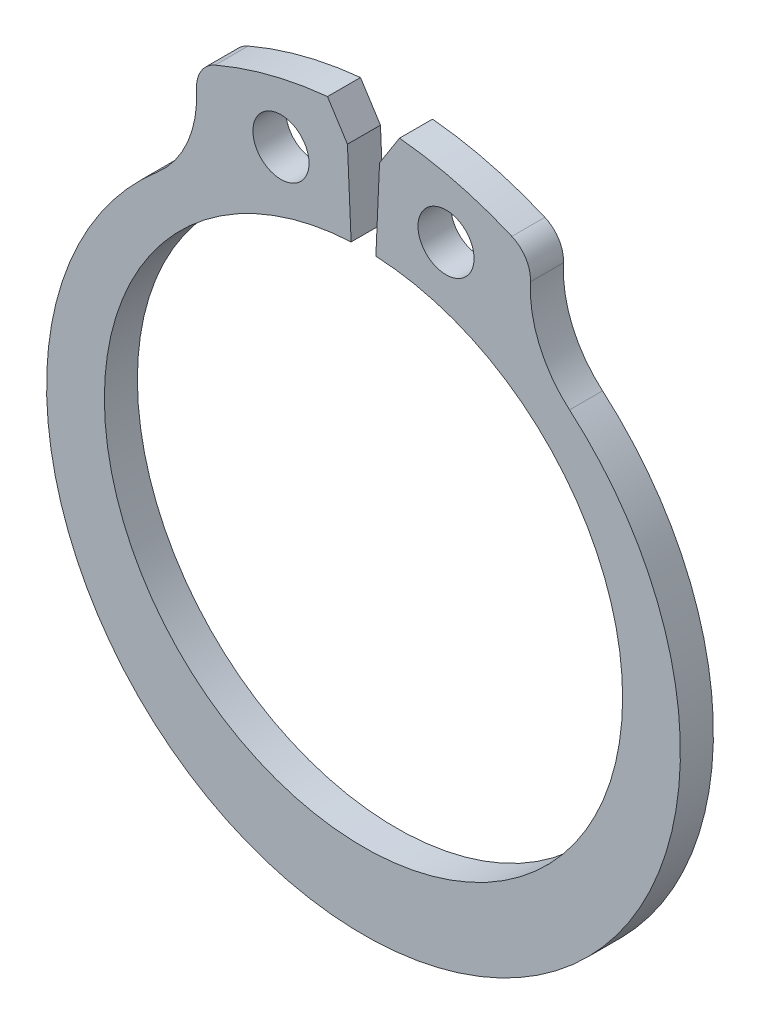
ISO-10303-21;
HEADER;
FILE_DESCRIPTION(('STEP AP214'),'2;1');
FILE_NAME('part.step','',(''),(''),'','','');
FILE_SCHEMA(('AUTOMOTIVE_DESIGN { 1 0 10303 214 1 1 1 1 }'));
ENDSEC;
DATA;
#1=APPLICATION_CONTEXT('core data for automotive mechanical design processes');
#2=APPLICATION_PROTOCOL_DEFINITION('international standard','automotive_design',2000,#1);
#3=PRODUCT_CONTEXT('',#1,'mechanical');
#4=PRODUCT('Part','Part','',(#3));
#5=PRODUCT_RELATED_PRODUCT_CATEGORY('part','',(#4));
#6=PRODUCT_DEFINITION_FORMATION('','',#4);
#7=PRODUCT_DEFINITION_CONTEXT('part definition',#1,'design');
#8=PRODUCT_DEFINITION('design','',#6,#7);
#9=PRODUCT_DEFINITION_SHAPE('','',#8);
#10=(LENGTH_UNIT() NAMED_UNIT(*) SI_UNIT(.MILLI.,.METRE.));
#11=(NAMED_UNIT(*) PLANE_ANGLE_UNIT() SI_UNIT($,.RADIAN.));
#12=(NAMED_UNIT(*) SI_UNIT($,.STERADIAN.) SOLID_ANGLE_UNIT());
#13=UNCERTAINTY_MEASURE_WITH_UNIT(LENGTH_MEASURE(1.E-05),#10,'distance_accuracy_value','');
#14=(GEOMETRIC_REPRESENTATION_CONTEXT(3) GLOBAL_UNCERTAINTY_ASSIGNED_CONTEXT((#13)) GLOBAL_UNIT_ASSIGNED_CONTEXT((#10,
#11,#12)) REPRESENTATION_CONTEXT('',''));
#15=CARTESIAN_POINT('',(0.,0.,0.));
#16=DIRECTION('',(0.,0.,1.));
#17=DIRECTION('',(1.,0.,0.));
#18=AXIS2_PLACEMENT_3D('',#15,#16,#17);
#19=CARTESIAN_POINT('',(0.,0.00859437985994194,0.5));
#20=DIRECTION('',(0.,0.,-1.));
#21=DIRECTION('',(1.,0.,0.));
#22=AXIS2_PLACEMENT_3D('',#19,#20,#21);
#23=CYLINDRICAL_SURFACE('',#22,1.9625);
#24=DIRECTION('',(0.,0.,1.));
#25=VECTOR('',#24,1.);
#26=CARTESIAN_POINT('',(0.0936240497671285,1.96885986884484,0.5));
#27=LINE('',#26,#25);
#28=CARTESIAN_POINT('',(0.0936240497671285,1.96885986884484,0.375));
#29=VERTEX_POINT('',#28);
#30=CARTESIAN_POINT('',(0.0936240497671285,1.96885986884484,0.625));
#31=VERTEX_POINT('',#30);
#32=EDGE_CURVE('E53',#29,#31,#27,.T.);
#33=ORIENTED_EDGE('',*,*,#32,.F.);
#34=CARTESIAN_POINT('',(0.,0.00859437985994194,0.375));
#35=DIRECTION('',(0.,0.,1.));
#36=DIRECTION('',(1.,0.,0.));
#37=AXIS2_PLACEMENT_3D('',#34,#35,#36);
#38=CIRCLE('',#37,1.9625);
#39=CARTESIAN_POINT('',(-0.0936240497671285,1.96885986884484,0.375));
#40=VERTEX_POINT('',#39);
#41=EDGE_CURVE('E143',#40,#29,#38,.T.);
#42=ORIENTED_EDGE('',*,*,#41,.F.);
#43=DIRECTION('',(0.,0.,-1.));
#44=VECTOR('',#43,1.);
#45=CARTESIAN_POINT('',(-0.0936240497671285,1.96885986884484,0.5));
#46=LINE('',#45,#44);
#47=CARTESIAN_POINT('',(-0.0936240497671285,1.96885986884484,0.625));
#48=VERTEX_POINT('',#47);
#49=EDGE_CURVE('E11',#48,#40,#46,.T.);
#50=ORIENTED_EDGE('',*,*,#49,.F.);
#51=CARTESIAN_POINT('',(0.,0.00859437985994194,0.625));
#52=DIRECTION('',(0.,0.,-1.));
#53=DIRECTION('',(1.,0.,0.));
#54=AXIS2_PLACEMENT_3D('',#51,#52,#53);
#55=CIRCLE('',#54,1.9625);
#56=EDGE_CURVE('E147',#31,#48,#55,.T.);
#57=ORIENTED_EDGE('',*,*,#56,.F.);
#58=EDGE_LOOP('',(#33,#42,#50,#57));
#59=FACE_BOUND('',#58,.T.);
#60=ADVANCED_FACE('F34',(#59),#23,.F.);
#61=CARTESIAN_POINT('',(-0.063877216940033,1.30234437985994,0.625));
#62=DIRECTION('',(0.999005550404976,0.0445859872611464,0.));
#63=DIRECTION('',(0.0445859872611464,-0.999005550404976,0.));
#64=AXIS2_PLACEMENT_3D('',#61,#62,#63);
#65=PLANE('',#64);
#66=ORIENTED_EDGE('',*,*,#49,.T.);
#67=DIRECTION('',(-0.0445859872611464,0.999005550404976,0.));
#68=VECTOR('',#67,1.);
#69=CARTESIAN_POINT('',(0.,-0.128905620140058,0.375));
#70=LINE('',#69,#68);
#71=CARTESIAN_POINT('',(-0.121617758016831,2.59609437985994,0.375));
#72=VERTEX_POINT('',#71);
#73=EDGE_CURVE('E44',#40,#72,#70,.T.);
#74=ORIENTED_EDGE('',*,*,#73,.T.);
#75=DIRECTION('',(0.,0.,-1.));
#76=VECTOR('',#75,1.);
#77=CARTESIAN_POINT('',(-0.121617758016832,2.59609437985994,0.625));
#78=LINE('',#77,#76);
#79=CARTESIAN_POINT('',(-0.121617758016832,2.59609437985994,0.625));
#80=VERTEX_POINT('',#79);
#81=EDGE_CURVE('E138',#80,#72,#78,.T.);
#82=ORIENTED_EDGE('',*,*,#81,.F.);
#83=DIRECTION('',(-0.0445859872611464,0.999005550404976,0.));
#84=VECTOR('',#83,1.);
#85=CARTESIAN_POINT('',(0.,-0.128905620140058,0.625));
#86=LINE('',#85,#84);
#87=EDGE_CURVE('E145',#48,#80,#86,.T.);
#88=ORIENTED_EDGE('',*,*,#87,.F.);
#89=EDGE_LOOP('',(#66,#74,#82,#88));
#90=FACE_BOUND('',#89,.T.);
#91=ADVANCED_FACE('F36',(#90),#65,.T.);
#92=CARTESIAN_POINT('',(0.896844712426765,0.102705488445193,0.375));
#93=DIRECTION('',(0.,0.,1.));
#94=DIRECTION('',(1.,0.,0.));
#95=AXIS2_PLACEMENT_3D('',#92,#93,#94);
#96=PLANE('',#95);
#97=ORIENTED_EDGE('',*,*,#41,.T.);
#98=DIRECTION('',(0.0445859872611464,0.999005550404976,0.));
#99=VECTOR('',#98,1.);
#100=CARTESIAN_POINT('',(0.,-0.128905620140058,0.375));
#101=LINE('',#100,#99);
#102=CARTESIAN_POINT('',(0.121617758016831,2.59609437985994,0.375));
#103=VERTEX_POINT('',#102);
#104=EDGE_CURVE('E159',#29,#103,#101,.T.);
#105=ORIENTED_EDGE('',*,*,#104,.T.);
#106=DIRECTION('',(0.53811537282345,0.842871191541792,0.));
#107=VECTOR('',#106,1.);
#108=CARTESIAN_POINT('',(0.121617758016831,2.59609437985994,0.375));
#109=LINE('',#108,#107);
#110=CARTESIAN_POINT('',(0.272832027434316,2.83294721454722,0.375));
#111=VERTEX_POINT('',#110);
#112=EDGE_CURVE('E151',#103,#111,#109,.T.);
#113=ORIENTED_EDGE('',*,*,#112,.T.);
#114=CARTESIAN_POINT('',(0.,0.00859437985994194,0.375));
#115=DIRECTION('',(0.,0.,1.));
#116=DIRECTION('',(1.,0.,0.));
#117=AXIS2_PLACEMENT_3D('',#114,#115,#116);
#118=CIRCLE('',#117,2.8375);
#119=CARTESIAN_POINT('',(1.12351685285583,2.61418761967097,0.375));
#120=VERTEX_POINT('',#119);
#121=EDGE_CURVE('E164',#120,#111,#118,.T.);
#122=ORIENTED_EDGE('',*,*,#121,.F.);
#123=CARTESIAN_POINT('',(1.03096282136506,2.39954183295526,0.375));
#124=DIRECTION('',(0.,0.,1.));
#125=DIRECTION('',(1.,0.,0.));
#126=AXIS2_PLACEMENT_3D('',#123,#124,#125);
#127=CIRCLE('',#126,0.23375);
#128=CARTESIAN_POINT('',(1.26436415394966,2.3867793705074,0.375));
#129=VERTEX_POINT('',#128);
#130=EDGE_CURVE('E200',#129,#120,#127,.T.);
#131=ORIENTED_EDGE('',*,*,#130,.F.);
#132=CARTESIAN_POINT('',(2.11309627243911,2.34037041615153,0.375));
#133=DIRECTION('',(0.,0.,1.));
#134=DIRECTION('',(1.,0.,0.));
#135=AXIS2_PLACEMENT_3D('',#132,#133,#134);
#136=CIRCLE('',#135,0.85);
#137=CARTESIAN_POINT('',(1.56044032426273,1.69455976050604,0.375));
#138=VERTEX_POINT('',#137);
#139=EDGE_CURVE('E148',#129,#138,#136,.T.);
#140=ORIENTED_EDGE('',*,*,#139,.T.);
#141=CARTESIAN_POINT('',(0.,-0.128905620140058,0.375));
#142=DIRECTION('',(0.,0.,1.));
#143=DIRECTION('',(1.,0.,0.));
#144=AXIS2_PLACEMENT_3D('',#141,#142,#143);
#145=CIRCLE('',#144,2.4);
#146=CARTESIAN_POINT('',(-1.56044032426273,1.69455976050604,0.374999999999999));
#147=VERTEX_POINT('',#146);
#148=EDGE_CURVE('E177',#147,#138,#145,.T.);
#149=ORIENTED_EDGE('',*,*,#148,.F.);
#150=CARTESIAN_POINT('',(-2.11309627243911,2.34037041615153,0.374999999999999));
#151=DIRECTION('',(0.,0.,-1.));
#152=DIRECTION('',(-1.,0.,0.));
#153=AXIS2_PLACEMENT_3D('',#150,#151,#152);
#154=CIRCLE('',#153,0.85);
#155=CARTESIAN_POINT('',(-1.26436415394966,2.3867793705074,0.374999999999999));
#156=VERTEX_POINT('',#155);
#157=EDGE_CURVE('E109',#156,#147,#154,.T.);
#158=ORIENTED_EDGE('',*,*,#157,.F.);
#159=CARTESIAN_POINT('',(-1.03096282136506,2.39954183295526,0.374999999999999));
#160=DIRECTION('',(0.,0.,1.));
#161=DIRECTION('',(-1.,0.,0.));
#162=AXIS2_PLACEMENT_3D('',#159,#160,#161);
#163=CIRCLE('',#162,0.23375);
#164=CARTESIAN_POINT('',(-1.12351685285583,2.61418761967097,0.374999999999999));
#165=VERTEX_POINT('',#164);
#166=EDGE_CURVE('E127',#165,#156,#163,.T.);
#167=ORIENTED_EDGE('',*,*,#166,.F.);
#168=CARTESIAN_POINT('',(0.,0.00859437985994194,0.375));
#169=DIRECTION('',(0.,0.,1.));
#170=DIRECTION('',(-1.,0.,0.));
#171=AXIS2_PLACEMENT_3D('',#168,#169,#170);
#172=CIRCLE('',#171,2.8375);
#173=CARTESIAN_POINT('',(-0.272832027434317,2.83294721454722,0.375));
#174=VERTEX_POINT('',#173);
#175=EDGE_CURVE('E104',#174,#165,#172,.T.);
#176=ORIENTED_EDGE('',*,*,#175,.F.);
#177=DIRECTION('',(-0.53811537282345,0.842871191541792,0.));
#178=VECTOR('',#177,1.);
#179=CARTESIAN_POINT('',(-0.121617758016831,2.59609437985994,0.375));
#180=LINE('',#179,#178);
#181=EDGE_CURVE('E134',#72,#174,#180,.T.);
#182=ORIENTED_EDGE('',*,*,#181,.F.);
#183=ORIENTED_EDGE('',*,*,#73,.F.);
#184=EDGE_LOOP('',(#97,#105,#113,#122,#131,#140,#149,#158,#167,#176,#182,#183));
#185=FACE_BOUND('',#184,.T.);
#186=CARTESIAN_POINT('',(0.625,2.32578556748344,0.375));
#187=DIRECTION('',(0.,0.,1.));
#188=DIRECTION('',(1.,0.,0.));
#189=AXIS2_PLACEMENT_3D('',#186,#187,#188);
#190=CIRCLE('',#189,0.2125);
#191=CARTESIAN_POINT('',(0.4125,2.32578556748344,0.375));
#192=VERTEX_POINT('',#191);
#193=EDGE_CURVE('E141',#192,#192,#190,.T.);
#194=ORIENTED_EDGE('',*,*,#193,.T.);
#195=EDGE_LOOP('',(#194));
#196=FACE_BOUND('',#195,.T.);
#197=CARTESIAN_POINT('',(-0.625,2.32578556748344,0.375));
#198=DIRECTION('',(0.,0.,1.));
#199=DIRECTION('',(-1.,0.,0.));
#200=AXIS2_PLACEMENT_3D('',#197,#198,#199);
#201=CIRCLE('',#200,0.2125);
#202=CARTESIAN_POINT('',(-0.4125,2.32578556748344,0.375));
#203=VERTEX_POINT('',#202);
#204=EDGE_CURVE('E137',#203,#203,#201,.T.);
#205=ORIENTED_EDGE('',*,*,#204,.T.);
#206=EDGE_LOOP('',(#205));
#207=FACE_BOUND('',#206,.T.);
#208=ADVANCED_FACE('F246',(#185,#196,#207),#96,.F.);
#209=CARTESIAN_POINT('',(-0.625,2.32578556748344,0.5));
#210=DIRECTION('',(0.,0.,1.));
#211=DIRECTION('',(-1.,0.,0.));
#212=AXIS2_PLACEMENT_3D('',#209,#210,#211);
#213=CYLINDRICAL_SURFACE('',#212,0.2125);
#214=CARTESIAN_POINT('',(-0.625,2.32578556748344,0.625));
#215=DIRECTION('',(0.,0.,-1.));
#216=DIRECTION('',(-1.,0.,0.));
#217=AXIS2_PLACEMENT_3D('',#214,#215,#216);
#218=CIRCLE('',#217,0.2125);
#219=CARTESIAN_POINT('',(-0.4125,2.32578556748344,0.625));
#220=VERTEX_POINT('',#219);
#221=EDGE_CURVE('E132',#220,#220,#218,.T.);
#222=ORIENTED_EDGE('',*,*,#221,.F.);
#223=EDGE_LOOP('',(#222));
#224=FACE_BOUND('',#223,.T.);
#225=ORIENTED_EDGE('',*,*,#204,.F.);
#226=EDGE_LOOP('',(#225));
#227=FACE_BOUND('',#226,.T.);
#228=ADVANCED_FACE('F272',(#224,#227),#213,.F.);
#229=CARTESIAN_POINT('',(-0.197224892725574,2.71452079720358,0.625));
#230=DIRECTION('',(0.842871191541792,0.53811537282345,0.));
#231=DIRECTION('',(0.53811537282345,-0.842871191541792,0.));
#232=AXIS2_PLACEMENT_3D('',#229,#230,#231);
#233=PLANE('',#232);
#234=ORIENTED_EDGE('',*,*,#181,.T.);
#235=DIRECTION('',(0.,0.,-1.));
#236=VECTOR('',#235,1.);
#237=CARTESIAN_POINT('',(-0.272832027434317,2.83294721454722,0.625));
#238=LINE('',#237,#236);
#239=CARTESIAN_POINT('',(-0.272832027434317,2.83294721454722,0.625));
#240=VERTEX_POINT('',#239);
#241=EDGE_CURVE('E122',#240,#174,#238,.T.);
#242=ORIENTED_EDGE('',*,*,#241,.F.);
#243=DIRECTION('',(-0.53811537282345,0.842871191541792,0.));
#244=VECTOR('',#243,1.);
#245=CARTESIAN_POINT('',(-0.121617758016832,2.59609437985994,0.625));
#246=LINE('',#245,#244);
#247=EDGE_CURVE('E120',#80,#240,#246,.T.);
#248=ORIENTED_EDGE('',*,*,#247,.F.);
#249=ORIENTED_EDGE('',*,*,#81,.T.);
#250=EDGE_LOOP('',(#234,#242,#248,#249));
#251=FACE_BOUND('',#250,.T.);
#252=ADVANCED_FACE('F302',(#251),#233,.T.);
#253=CARTESIAN_POINT('',(0.,0.00859437985994194,0.625));
#254=DIRECTION('',(0.,0.,1.));
#255=DIRECTION('',(-1.,0.,0.));
#256=AXIS2_PLACEMENT_3D('',#253,#254,#255);
#257=CYLINDRICAL_SURFACE('',#256,2.8375);
#258=ORIENTED_EDGE('',*,*,#175,.T.);
#259=DIRECTION('',(0.,0.,-1.));
#260=VECTOR('',#259,1.);
#261=CARTESIAN_POINT('',(-1.12351685285583,2.61418761967097,0.625));
#262=LINE('',#261,#260);
#263=CARTESIAN_POINT('',(-1.12351685285583,2.61418761967097,0.625));
#264=VERTEX_POINT('',#263);
#265=EDGE_CURVE('E97',#264,#165,#262,.T.);
#266=ORIENTED_EDGE('',*,*,#265,.F.);
#267=CARTESIAN_POINT('',(0.,0.00859437985994194,0.625));
#268=DIRECTION('',(0.,0.,-1.));
#269=DIRECTION('',(-1.,0.,0.));
#270=AXIS2_PLACEMENT_3D('',#267,#268,#269);
#271=CIRCLE('',#270,2.8375);
#272=EDGE_CURVE('E101',#264,#240,#271,.T.);
#273=ORIENTED_EDGE('',*,*,#272,.T.);
#274=ORIENTED_EDGE('',*,*,#241,.T.);
#275=EDGE_LOOP('',(#258,#266,#273,#274));
#276=FACE_BOUND('',#275,.T.);
#277=ADVANCED_FACE('F99',(#276),#257,.T.);
#278=CARTESIAN_POINT('',(-1.03096282136506,2.39954183295526,0.625));
#279=DIRECTION('',(0.,0.,1.));
#280=DIRECTION('',(-1.,0.,0.));
#281=AXIS2_PLACEMENT_3D('',#278,#279,#280);
#282=CYLINDRICAL_SURFACE('',#281,0.23375);
#283=ORIENTED_EDGE('',*,*,#166,.T.);
#284=DIRECTION('',(0.,0.,-1.));
#285=VECTOR('',#284,1.);
#286=CARTESIAN_POINT('',(-1.26436415394966,2.3867793705074,0.625));
#287=LINE('',#286,#285);
#288=CARTESIAN_POINT('',(-1.26436415394966,2.3867793705074,0.625));
#289=VERTEX_POINT('',#288);
#290=EDGE_CURVE('E126',#289,#156,#287,.T.);
#291=ORIENTED_EDGE('',*,*,#290,.F.);
#292=CARTESIAN_POINT('',(-1.03096282136506,2.39954183295526,0.625));
#293=DIRECTION('',(0.,0.,-1.));
#294=DIRECTION('',(-1.,0.,0.));
#295=AXIS2_PLACEMENT_3D('',#292,#293,#294);
#296=CIRCLE('',#295,0.23375);
#297=EDGE_CURVE('E108',#289,#264,#296,.T.);
#298=ORIENTED_EDGE('',*,*,#297,.T.);
#299=ORIENTED_EDGE('',*,*,#265,.T.);
#300=EDGE_LOOP('',(#283,#291,#298,#299));
#301=FACE_BOUND('',#300,.T.);
#302=ADVANCED_FACE('F124',(#301),#282,.T.);
#303=CARTESIAN_POINT('',(-2.11309627243911,2.34037041615153,0.625));
#304=DIRECTION('',(0.,0.,1.));
#305=DIRECTION('',(-1.,0.,0.));
#306=AXIS2_PLACEMENT_3D('',#303,#304,#305);
#307=CYLINDRICAL_SURFACE('',#306,0.85);
#308=ORIENTED_EDGE('',*,*,#157,.T.);
#309=DIRECTION('',(0.,0.,-1.));
#310=VECTOR('',#309,1.);
#311=CARTESIAN_POINT('',(-1.56044032426273,1.69455976050604,0.625));
#312=LINE('',#311,#310);
#313=CARTESIAN_POINT('',(-1.56044032426273,1.69455976050604,0.625));
#314=VERTEX_POINT('',#313);
#315=EDGE_CURVE('E179',#314,#147,#312,.T.);
#316=ORIENTED_EDGE('',*,*,#315,.F.);
#317=CARTESIAN_POINT('',(-2.11309627243911,2.34037041615153,0.625));
#318=DIRECTION('',(0.,0.,-1.));
#319=DIRECTION('',(-1.,0.,0.));
#320=AXIS2_PLACEMENT_3D('',#317,#318,#319);
#321=CIRCLE('',#320,0.85);
#322=EDGE_CURVE('E203',#289,#314,#321,.T.);
#323=ORIENTED_EDGE('',*,*,#322,.F.);
#324=ORIENTED_EDGE('',*,*,#290,.T.);
#325=EDGE_LOOP('',(#308,#316,#323,#324));
#326=FACE_BOUND('',#325,.T.);
#327=ADVANCED_FACE('F217',(#326),#307,.F.);
#328=CARTESIAN_POINT('',(0.625,2.32578556748344,0.5));
#329=DIRECTION('',(0.,0.,-1.));
#330=DIRECTION('',(1.,0.,0.));
#331=AXIS2_PLACEMENT_3D('',#328,#329,#330);
#332=CYLINDRICAL_SURFACE('',#331,0.2125);
#333=ORIENTED_EDGE('',*,*,#193,.F.);
#334=EDGE_LOOP('',(#333));
#335=FACE_BOUND('',#334,.T.);
#336=CARTESIAN_POINT('',(0.625,2.32578556748344,0.625));
#337=DIRECTION('',(0.,0.,-1.));
#338=DIRECTION('',(1.,0.,0.));
#339=AXIS2_PLACEMENT_3D('',#336,#337,#338);
#340=CIRCLE('',#339,0.2125);
#341=CARTESIAN_POINT('',(0.4125,2.32578556748344,0.625));
#342=VERTEX_POINT('',#341);
#343=EDGE_CURVE('E192',#342,#342,#340,.T.);
#344=ORIENTED_EDGE('',*,*,#343,.F.);
#345=EDGE_LOOP('',(#344));
#346=FACE_BOUND('',#345,.T.);
#347=ADVANCED_FACE('F259',(#335,#346),#332,.F.);
#348=CARTESIAN_POINT('',(0.063877216940033,1.30234437985994,0.375));
#349=DIRECTION('',(-0.999005550404976,0.0445859872611464,0.));
#350=DIRECTION('',(-0.0445859872611464,-0.999005550404976,0.));
#351=AXIS2_PLACEMENT_3D('',#348,#349,#350);
#352=PLANE('',#351);
#353=ORIENTED_EDGE('',*,*,#32,.T.);
#354=DIRECTION('',(0.0445859872611464,0.999005550404976,0.));
#355=VECTOR('',#354,1.);
#356=CARTESIAN_POINT('',(0.,-0.128905620140058,0.625));
#357=LINE('',#356,#355);
#358=CARTESIAN_POINT('',(0.121617758016831,2.59609437985994,0.625));
#359=VERTEX_POINT('',#358);
#360=EDGE_CURVE('E152',#31,#359,#357,.T.);
#361=ORIENTED_EDGE('',*,*,#360,.T.);
#362=DIRECTION('',(0.,0.,1.));
#363=VECTOR('',#362,1.);
#364=CARTESIAN_POINT('',(0.121617758016831,2.59609437985994,0.375));
#365=LINE('',#364,#363);
#366=EDGE_CURVE('E169',#103,#359,#365,.T.);
#367=ORIENTED_EDGE('',*,*,#366,.F.);
#368=ORIENTED_EDGE('',*,*,#104,.F.);
#369=EDGE_LOOP('',(#353,#361,#367,#368));
#370=FACE_BOUND('',#369,.T.);
#371=ADVANCED_FACE('F251',(#370),#352,.T.);
#372=CARTESIAN_POINT('',(0.197224892725574,2.71452079720358,0.375));
#373=DIRECTION('',(-0.842871191541792,0.53811537282345,0.));
#374=DIRECTION('',(-0.53811537282345,-0.842871191541792,0.));
#375=AXIS2_PLACEMENT_3D('',#372,#373,#374);
#376=PLANE('',#375);
#377=DIRECTION('',(0.53811537282345,0.842871191541792,0.));
#378=VECTOR('',#377,1.);
#379=CARTESIAN_POINT('',(0.121617758016831,2.59609437985994,0.625));
#380=LINE('',#379,#378);
#381=CARTESIAN_POINT('',(0.272832027434316,2.83294721454722,0.625));
#382=VERTEX_POINT('',#381);
#383=EDGE_CURVE('E155',#359,#382,#380,.T.);
#384=ORIENTED_EDGE('',*,*,#383,.T.);
#385=DIRECTION('',(0.,0.,1.));
#386=VECTOR('',#385,1.);
#387=CARTESIAN_POINT('',(0.272832027434316,2.83294721454722,0.375));
#388=LINE('',#387,#386);
#389=EDGE_CURVE('E162',#111,#382,#388,.T.);
#390=ORIENTED_EDGE('',*,*,#389,.F.);
#391=ORIENTED_EDGE('',*,*,#112,.F.);
#392=ORIENTED_EDGE('',*,*,#366,.T.);
#393=EDGE_LOOP('',(#384,#390,#391,#392));
#394=FACE_BOUND('',#393,.T.);
#395=ADVANCED_FACE('F249',(#394),#376,.T.);
#396=CARTESIAN_POINT('',(0.,0.00859437985994194,0.375));
#397=DIRECTION('',(0.,0.,-1.));
#398=DIRECTION('',(1.,0.,0.));
#399=AXIS2_PLACEMENT_3D('',#396,#397,#398);
#400=CYLINDRICAL_SURFACE('',#399,2.8375);
#401=CARTESIAN_POINT('',(0.,0.00859437985994194,0.625));
#402=DIRECTION('',(0.,0.,-1.));
#403=DIRECTION('',(1.,0.,0.));
#404=AXIS2_PLACEMENT_3D('',#401,#402,#403);
#405=CIRCLE('',#404,2.8375);
#406=CARTESIAN_POINT('',(1.12351685285583,2.61418761967097,0.625));
#407=VERTEX_POINT('',#406);
#408=EDGE_CURVE('E166',#382,#407,#405,.T.);
#409=ORIENTED_EDGE('',*,*,#408,.T.);
#410=DIRECTION('',(0.,0.,1.));
#411=VECTOR('',#410,1.);
#412=CARTESIAN_POINT('',(1.12351685285583,2.61418761967097,0.375));
#413=LINE('',#412,#411);
#414=EDGE_CURVE('E173',#120,#407,#413,.T.);
#415=ORIENTED_EDGE('',*,*,#414,.F.);
#416=ORIENTED_EDGE('',*,*,#121,.T.);
#417=ORIENTED_EDGE('',*,*,#389,.T.);
#418=EDGE_LOOP('',(#409,#415,#416,#417));
#419=FACE_BOUND('',#418,.T.);
#420=ADVANCED_FACE('F243',(#419),#400,.T.);
#421=CARTESIAN_POINT('',(1.03096282136506,2.39954183295526,0.375));
#422=DIRECTION('',(0.,0.,-1.));
#423=DIRECTION('',(1.,0.,0.));
#424=AXIS2_PLACEMENT_3D('',#421,#422,#423);
#425=CYLINDRICAL_SURFACE('',#424,0.23375);
#426=CARTESIAN_POINT('',(1.03096282136506,2.39954183295526,0.625));
#427=DIRECTION('',(0.,0.,-1.));
#428=DIRECTION('',(1.,0.,0.));
#429=AXIS2_PLACEMENT_3D('',#426,#427,#428);
#430=CIRCLE('',#429,0.23375);
#431=CARTESIAN_POINT('',(1.26436415394966,2.3867793705074,0.625));
#432=VERTEX_POINT('',#431);
#433=EDGE_CURVE('E165',#407,#432,#430,.T.);
#434=ORIENTED_EDGE('',*,*,#433,.T.);
#435=DIRECTION('',(0.,0.,1.));
#436=VECTOR('',#435,1.);
#437=CARTESIAN_POINT('',(1.26436415394966,2.3867793705074,0.375));
#438=LINE('',#437,#436);
#439=EDGE_CURVE('E174',#129,#432,#438,.T.);
#440=ORIENTED_EDGE('',*,*,#439,.F.);
#441=ORIENTED_EDGE('',*,*,#130,.T.);
#442=ORIENTED_EDGE('',*,*,#414,.T.);
#443=EDGE_LOOP('',(#434,#440,#441,#442));
#444=FACE_BOUND('',#443,.T.);
#445=ADVANCED_FACE('F257',(#444),#425,.T.);
#446=CARTESIAN_POINT('',(2.11309627243911,2.34037041615153,0.375));
#447=DIRECTION('',(0.,0.,-1.));
#448=DIRECTION('',(1.,0.,0.));
#449=AXIS2_PLACEMENT_3D('',#446,#447,#448);
#450=CYLINDRICAL_SURFACE('',#449,0.85);
#451=CARTESIAN_POINT('',(2.11309627243911,2.34037041615153,0.625));
#452=DIRECTION('',(0.,0.,1.));
#453=DIRECTION('',(1.,0.,0.));
#454=AXIS2_PLACEMENT_3D('',#451,#452,#453);
#455=CIRCLE('',#454,0.85);
#456=CARTESIAN_POINT('',(1.56044032426273,1.69455976050604,0.625));
#457=VERTEX_POINT('',#456);
#458=EDGE_CURVE('E170',#432,#457,#455,.T.);
#459=ORIENTED_EDGE('',*,*,#458,.T.);
#460=DIRECTION('',(0.,0.,1.));
#461=VECTOR('',#460,1.);
#462=CARTESIAN_POINT('',(1.56044032426273,1.69455976050604,0.375));
#463=LINE('',#462,#461);
#464=EDGE_CURVE('E38',#138,#457,#463,.T.);
#465=ORIENTED_EDGE('',*,*,#464,.F.);
#466=ORIENTED_EDGE('',*,*,#139,.F.);
#467=ORIENTED_EDGE('',*,*,#439,.T.);
#468=EDGE_LOOP('',(#459,#465,#466,#467));
#469=FACE_BOUND('',#468,.T.);
#470=ADVANCED_FACE('F279',(#469),#450,.F.);
#471=CARTESIAN_POINT('',(0.,-0.128905620140058,0.375));
#472=DIRECTION('',(0.,0.,-1.));
#473=DIRECTION('',(1.,0.,0.));
#474=AXIS2_PLACEMENT_3D('',#471,#472,#473);
#475=CYLINDRICAL_SURFACE('',#474,2.4);
#476=CARTESIAN_POINT('',(0.,-0.128905620140058,0.625));
#477=DIRECTION('',(0.,0.,-1.));
#478=DIRECTION('',(1.,0.,0.));
#479=AXIS2_PLACEMENT_3D('',#476,#477,#478);
#480=CIRCLE('',#479,2.4);
#481=EDGE_CURVE('E198',#457,#314,#480,.T.);
#482=ORIENTED_EDGE('',*,*,#481,.T.);
#483=ORIENTED_EDGE('',*,*,#315,.T.);
#484=ORIENTED_EDGE('',*,*,#148,.T.);
#485=ORIENTED_EDGE('',*,*,#464,.T.);
#486=EDGE_LOOP('',(#482,#483,#484,#485));
#487=FACE_BOUND('',#486,.T.);
#488=ADVANCED_FACE('F281',(#487),#475,.T.);
#489=CARTESIAN_POINT('',(0.896844712426765,0.102705488445193,0.625));
#490=DIRECTION('',(0.,0.,1.));
#491=DIRECTION('',(1.,0.,0.));
#492=AXIS2_PLACEMENT_3D('',#489,#490,#491);
#493=PLANE('',#492);
#494=ORIENTED_EDGE('',*,*,#56,.T.);
#495=ORIENTED_EDGE('',*,*,#87,.T.);
#496=ORIENTED_EDGE('',*,*,#247,.T.);
#497=ORIENTED_EDGE('',*,*,#272,.F.);
#498=ORIENTED_EDGE('',*,*,#297,.F.);
#499=ORIENTED_EDGE('',*,*,#322,.T.);
#500=ORIENTED_EDGE('',*,*,#481,.F.);
#501=ORIENTED_EDGE('',*,*,#458,.F.);
#502=ORIENTED_EDGE('',*,*,#433,.F.);
#503=ORIENTED_EDGE('',*,*,#408,.F.);
#504=ORIENTED_EDGE('',*,*,#383,.F.);
#505=ORIENTED_EDGE('',*,*,#360,.F.);
#506=EDGE_LOOP('',(#494,#495,#496,#497,#498,#499,#500,#501,#502,#503,#504,#505));
#507=FACE_BOUND('',#506,.T.);
#508=ORIENTED_EDGE('',*,*,#221,.T.);
#509=EDGE_LOOP('',(#508));
#510=FACE_BOUND('',#509,.T.);
#511=ORIENTED_EDGE('',*,*,#343,.T.);
#512=EDGE_LOOP('',(#511));
#513=FACE_BOUND('',#512,.T.);
#514=ADVANCED_FACE('F114',(#507,#510,#513),#493,.T.);
#515=CLOSED_SHELL('',(#60,#91,#208,#228,#252,#277,#302,#327,#347,#371,#395,#420,#445,#470,#488,#514));
#516=MANIFOLD_SOLID_BREP('B2',#515);
#517=ADVANCED_BREP_SHAPE_REPRESENTATION('',(#18,#516),#14);
#518=SHAPE_DEFINITION_REPRESENTATION(#9,#517);
ENDSEC;
END-ISO-10303-21;
